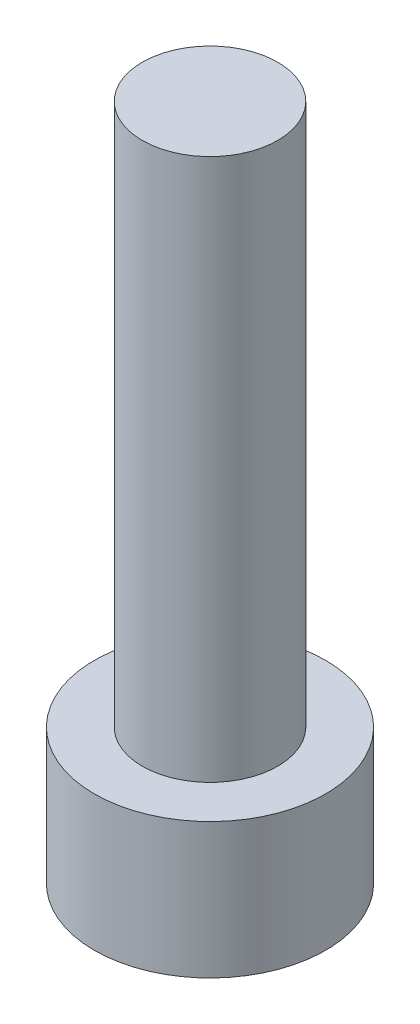
ISO-10303-21;
HEADER;
FILE_DESCRIPTION(('STEP AP214'),'2;1');
FILE_NAME('part.step','',(''),(''),'','','');
FILE_SCHEMA(('AUTOMOTIVE_DESIGN { 1 0 10303 214 1 1 1 1 }'));
ENDSEC;
DATA;
#1=APPLICATION_CONTEXT('core data for automotive mechanical design processes');
#2=APPLICATION_PROTOCOL_DEFINITION('international standard','automotive_design',2000,#1);
#3=PRODUCT_CONTEXT('',#1,'mechanical');
#4=PRODUCT('Part','Part','',(#3));
#5=PRODUCT_RELATED_PRODUCT_CATEGORY('part','',(#4));
#6=PRODUCT_DEFINITION_FORMATION('','',#4);
#7=PRODUCT_DEFINITION_CONTEXT('part definition',#1,'design');
#8=PRODUCT_DEFINITION('design','',#6,#7);
#9=PRODUCT_DEFINITION_SHAPE('','',#8);
#10=(LENGTH_UNIT() NAMED_UNIT(*) SI_UNIT(.MILLI.,.METRE.));
#11=(NAMED_UNIT(*) PLANE_ANGLE_UNIT() SI_UNIT($,.RADIAN.));
#12=(NAMED_UNIT(*) SI_UNIT($,.STERADIAN.) SOLID_ANGLE_UNIT());
#13=UNCERTAINTY_MEASURE_WITH_UNIT(LENGTH_MEASURE(1.E-05),#10,'distance_accuracy_value','');
#14=(GEOMETRIC_REPRESENTATION_CONTEXT(3) GLOBAL_UNCERTAINTY_ASSIGNED_CONTEXT((#13)) GLOBAL_UNIT_ASSIGNED_CONTEXT((#10,
#11,#12)) REPRESENTATION_CONTEXT('',''));
#15=CARTESIAN_POINT('',(0.,0.,0.));
#16=DIRECTION('',(0.,0.,1.));
#17=DIRECTION('',(1.,0.,0.));
#18=AXIS2_PLACEMENT_3D('',#15,#16,#17);
#19=CARTESIAN_POINT('',(0.,4.,0.));
#20=DIRECTION('',(0.,-1.,0.));
#21=DIRECTION('',(0.,0.,-1.));
#22=AXIS2_PLACEMENT_3D('',#19,#20,#21);
#23=CYLINDRICAL_SURFACE('',#22,3.415);
#24=CARTESIAN_POINT('',(0.,4.,0.));
#25=DIRECTION('',(0.,1.,0.));
#26=DIRECTION('',(0.,0.,1.));
#27=AXIS2_PLACEMENT_3D('',#24,#25,#26);
#28=CIRCLE('',#27,3.415);
#29=CARTESIAN_POINT('',(0.,4.,3.415));
#30=VERTEX_POINT('',#29);
#31=EDGE_CURVE('E10',#30,#30,#28,.T.);
#32=ORIENTED_EDGE('',*,*,#31,.F.);
#33=EDGE_LOOP('',(#32));
#34=FACE_BOUND('',#33,.T.);
#35=CARTESIAN_POINT('',(0.,0.,0.));
#36=DIRECTION('',(0.,1.,0.));
#37=DIRECTION('',(0.,0.,1.));
#38=AXIS2_PLACEMENT_3D('',#35,#36,#37);
#39=CIRCLE('',#38,3.415);
#40=CARTESIAN_POINT('',(0.,0.,3.415));
#41=VERTEX_POINT('',#40);
#42=EDGE_CURVE('E34',#41,#41,#39,.T.);
#43=ORIENTED_EDGE('',*,*,#42,.T.);
#44=EDGE_LOOP('',(#43));
#45=FACE_BOUND('',#44,.T.);
#46=ADVANCED_FACE('F31',(#34,#45),#23,.T.);
#47=CARTESIAN_POINT('',(0.,4.,0.));
#48=DIRECTION('',(0.,1.,0.));
#49=DIRECTION('',(0.,0.,1.));
#50=AXIS2_PLACEMENT_3D('',#47,#48,#49);
#51=PLANE('',#50);
#52=CARTESIAN_POINT('',(0.,4.,0.));
#53=DIRECTION('',(0.,1.,0.));
#54=DIRECTION('',(0.,0.,1.));
#55=AXIS2_PLACEMENT_3D('',#52,#53,#54);
#56=CIRCLE('',#55,2.);
#57=CARTESIAN_POINT('',(0.,4.,2.));
#58=VERTEX_POINT('',#57);
#59=EDGE_CURVE('E43',#58,#58,#56,.T.);
#60=ORIENTED_EDGE('',*,*,#59,.F.);
#61=EDGE_LOOP('',(#60));
#62=FACE_BOUND('',#61,.T.);
#63=ORIENTED_EDGE('',*,*,#31,.T.);
#64=EDGE_LOOP('',(#63));
#65=FACE_BOUND('',#64,.T.);
#66=ADVANCED_FACE('F58',(#62,#65),#51,.T.);
#67=CARTESIAN_POINT('',(0.,0.,0.));
#68=DIRECTION('',(0.,1.,0.));
#69=DIRECTION('',(0.,0.,1.));
#70=AXIS2_PLACEMENT_3D('',#67,#68,#69);
#71=PLANE('',#70);
#72=ORIENTED_EDGE('',*,*,#42,.F.);
#73=EDGE_LOOP('',(#72));
#74=FACE_BOUND('',#73,.T.);
#75=ADVANCED_FACE('F54',(#74),#71,.F.);
#76=CARTESIAN_POINT('',(0.,20.,0.));
#77=DIRECTION('',(0.,-1.,0.));
#78=DIRECTION('',(0.,0.,-1.));
#79=AXIS2_PLACEMENT_3D('',#76,#77,#78);
#80=CYLINDRICAL_SURFACE('',#79,2.);
#81=CARTESIAN_POINT('',(0.,20.,0.));
#82=DIRECTION('',(0.,1.,0.));
#83=DIRECTION('',(0.,0.,1.));
#84=AXIS2_PLACEMENT_3D('',#81,#82,#83);
#85=CIRCLE('',#84,2.);
#86=CARTESIAN_POINT('',(0.,20.,2.));
#87=VERTEX_POINT('',#86);
#88=EDGE_CURVE('E41',#87,#87,#85,.T.);
#89=ORIENTED_EDGE('',*,*,#88,.F.);
#90=EDGE_LOOP('',(#89));
#91=FACE_BOUND('',#90,.T.);
#92=ORIENTED_EDGE('',*,*,#59,.T.);
#93=EDGE_LOOP('',(#92));
#94=FACE_BOUND('',#93,.T.);
#95=ADVANCED_FACE('F51',(#91,#94),#80,.T.);
#96=CARTESIAN_POINT('',(0.,20.,0.));
#97=DIRECTION('',(0.,1.,0.));
#98=DIRECTION('',(0.,0.,1.));
#99=AXIS2_PLACEMENT_3D('',#96,#97,#98);
#100=PLANE('',#99);
#101=ORIENTED_EDGE('',*,*,#88,.T.);
#102=EDGE_LOOP('',(#101));
#103=FACE_BOUND('',#102,.T.);
#104=ADVANCED_FACE('F49',(#103),#100,.T.);
#105=CLOSED_SHELL('',(#46,#66,#75,#95,#104));
#106=MANIFOLD_SOLID_BREP('B2',#105);
#107=ADVANCED_BREP_SHAPE_REPRESENTATION('',(#18,#106),#14);
#108=SHAPE_DEFINITION_REPRESENTATION(#9,#107);
ENDSEC;
END-ISO-10303-21;
